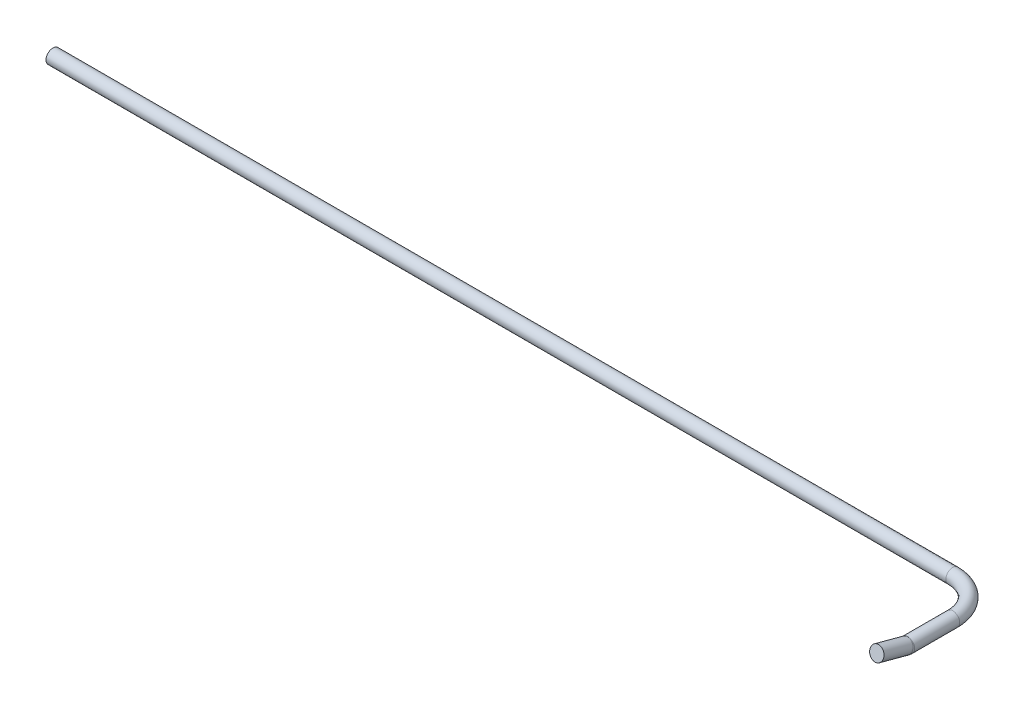
ISO-10303-21;
HEADER;
FILE_DESCRIPTION(('STEP AP214'),'2;1');
FILE_NAME('part.step','',(''),(''),'','','');
FILE_SCHEMA(('AUTOMOTIVE_DESIGN { 1 0 10303 214 1 1 1 1 }'));
ENDSEC;
DATA;
#1=APPLICATION_CONTEXT('core data for automotive mechanical design processes');
#2=APPLICATION_PROTOCOL_DEFINITION('international standard','automotive_design',2000,#1);
#3=PRODUCT_CONTEXT('',#1,'mechanical');
#4=PRODUCT('Part','Part','',(#3));
#5=PRODUCT_RELATED_PRODUCT_CATEGORY('part','',(#4));
#6=PRODUCT_DEFINITION_FORMATION('','',#4);
#7=PRODUCT_DEFINITION_CONTEXT('part definition',#1,'design');
#8=PRODUCT_DEFINITION('design','',#6,#7);
#9=PRODUCT_DEFINITION_SHAPE('','',#8);
#10=(LENGTH_UNIT() NAMED_UNIT(*) SI_UNIT(.MILLI.,.METRE.));
#11=(NAMED_UNIT(*) PLANE_ANGLE_UNIT() SI_UNIT($,.RADIAN.));
#12=(NAMED_UNIT(*) SI_UNIT($,.STERADIAN.) SOLID_ANGLE_UNIT());
#13=UNCERTAINTY_MEASURE_WITH_UNIT(LENGTH_MEASURE(1.E-05),#10,'distance_accuracy_value','');
#14=(GEOMETRIC_REPRESENTATION_CONTEXT(3) GLOBAL_UNCERTAINTY_ASSIGNED_CONTEXT((#13)) GLOBAL_UNIT_ASSIGNED_CONTEXT((#10,
#11,#12)) REPRESENTATION_CONTEXT('',''));
#15=CARTESIAN_POINT('',(0.,0.,0.));
#16=DIRECTION('',(0.,0.,1.));
#17=DIRECTION('',(1.,0.,0.));
#18=AXIS2_PLACEMENT_3D('',#15,#16,#17);
#19=CARTESIAN_POINT('',(0.,0.,-7.62));
#20=DIRECTION('',(0.,0.,1.));
#21=DIRECTION('',(1.,0.,0.));
#22=AXIS2_PLACEMENT_3D('',#19,#20,#21);
#23=CYLINDRICAL_SURFACE('',#22,1.1811);
#24=CARTESIAN_POINT('',(0.,0.,-7.62));
#25=DIRECTION('',(0.,0.,-1.));
#26=DIRECTION('',(-1.,0.,0.));
#27=AXIS2_PLACEMENT_3D('',#24,#25,#26);
#28=CIRCLE('',#27,1.1811);
#29=CARTESIAN_POINT('',(1.1811,0.,-7.62));
#30=VERTEX_POINT('',#29);
#31=EDGE_CURVE('E41',#30,#30,#28,.T.);
#32=ORIENTED_EDGE('',*,*,#31,.F.);
#33=EDGE_LOOP('',(#32));
#34=FACE_BOUND('',#33,.T.);
#35=CARTESIAN_POINT('',(0.,0.,0.));
#36=DIRECTION('',(0.,0.,1.));
#37=DIRECTION('',(1.,0.,0.));
#38=AXIS2_PLACEMENT_3D('',#35,#36,#37);
#39=CIRCLE('',#38,1.1811);
#40=CARTESIAN_POINT('',(0.,-1.1811,0.));
#41=VERTEX_POINT('',#40);
#42=EDGE_CURVE('E10',#41,#41,#39,.T.);
#43=ORIENTED_EDGE('',*,*,#42,.F.);
#44=EDGE_LOOP('',(#43));
#45=FACE_BOUND('',#44,.T.);
#46=ADVANCED_FACE('F31',(#34,#45),#23,.T.);
#47=CARTESIAN_POINT('',(-6.35,0.,-7.62));
#48=DIRECTION('',(0.,-1.,0.));
#49=DIRECTION('',(0.,0.,-1.));
#50=AXIS2_PLACEMENT_3D('',#47,#48,#49);
#51=TOROIDAL_SURFACE('',#50,6.35,1.1811);
#52=CARTESIAN_POINT('',(-6.35000000000002,0.,-13.97));
#53=DIRECTION('',(-1.,0.,0.));
#54=DIRECTION('',(0.,0.,1.));
#55=AXIS2_PLACEMENT_3D('',#52,#53,#54);
#56=CIRCLE('',#55,1.1811);
#57=CARTESIAN_POINT('',(-6.35000000000003,0.,-15.1511));
#58=VERTEX_POINT('',#57);
#59=EDGE_CURVE('E37',#58,#58,#56,.T.);
#60=CARTESIAN_POINT('',(-6.35,0.,-7.62));
#61=DIRECTION('',(0.,-1.,0.));
#62=DIRECTION('',(0.,0.,-1.));
#63=AXIS2_PLACEMENT_3D('',#60,#61,#62);
#64=CIRCLE('',#63,7.5311);
#65=EDGE_CURVE('',#58,#30,#64,.T.);
#66=ORIENTED_EDGE('',*,*,#59,.F.);
#67=ORIENTED_EDGE('',*,*,#31,.T.);
#68=ORIENTED_EDGE('',*,*,#65,.T.);
#69=ORIENTED_EDGE('',*,*,#65,.F.);
#70=EDGE_LOOP('',(#66,#68,#67,#69));
#71=FACE_BOUND('',#70,.T.);
#72=ADVANCED_FACE('F76',(#71),#51,.T.);
#73=CARTESIAN_POINT('',(-158.75,0.,-13.9699999999995));
#74=DIRECTION('',(1.,0.,0.));
#75=DIRECTION('',(0.,0.,-1.));
#76=AXIS2_PLACEMENT_3D('',#73,#74,#75);
#77=CYLINDRICAL_SURFACE('',#76,1.1811);
#78=CARTESIAN_POINT('',(-158.75,0.,-13.9699999999995));
#79=DIRECTION('',(-1.,0.,0.));
#80=DIRECTION('',(0.,0.,1.));
#81=AXIS2_PLACEMENT_3D('',#78,#79,#80);
#82=CIRCLE('',#81,1.1811);
#83=CARTESIAN_POINT('',(-158.75,0.,-15.1510999999995));
#84=VERTEX_POINT('',#83);
#85=EDGE_CURVE('E45',#84,#84,#82,.T.);
#86=CARTESIAN_POINT('',(-158.75,0.,-15.1510999999995));
#87=CARTESIAN_POINT('',(-157.1625,0.,-15.1510999999995));
#88=CARTESIAN_POINT('',(-155.575,0.,-15.1510999999995));
#89=CARTESIAN_POINT('',(-152.4,0.,-15.1510999999995));
#90=CARTESIAN_POINT('',(-150.8125,0.,-15.1510999999995));
#91=CARTESIAN_POINT('',(-147.6375,0.,-15.1510999999995));
#92=CARTESIAN_POINT('',(-146.05,0.,-15.1510999999995));
#93=CARTESIAN_POINT('',(-142.875,0.,-15.1510999999995));
#94=CARTESIAN_POINT('',(-141.2875,0.,-15.1510999999995));
#95=CARTESIAN_POINT('',(-138.1125,0.,-15.1510999999995));
#96=CARTESIAN_POINT('',(-136.525,0.,-15.1510999999995));
#97=CARTESIAN_POINT('',(-133.35,0.,-15.1510999999996));
#98=CARTESIAN_POINT('',(-131.7625,0.,-15.1510999999996));
#99=CARTESIAN_POINT('',(-128.5875,0.,-15.1510999999996));
#100=CARTESIAN_POINT('',(-127.,0.,-15.1510999999996));
#101=CARTESIAN_POINT('',(-123.825,0.,-15.1510999999996));
#102=CARTESIAN_POINT('',(-122.2375,0.,-15.1510999999996));
#103=CARTESIAN_POINT('',(-119.0625,0.,-15.1510999999996));
#104=CARTESIAN_POINT('',(-117.475,0.,-15.1510999999996));
#105=CARTESIAN_POINT('',(-114.3,0.,-15.1510999999996));
#106=CARTESIAN_POINT('',(-112.7125,0.,-15.1510999999996));
#107=CARTESIAN_POINT('',(-109.5375,0.,-15.1510999999996));
#108=CARTESIAN_POINT('',(-107.95,0.,-15.1510999999996));
#109=CARTESIAN_POINT('',(-104.775,0.,-15.1510999999997));
#110=CARTESIAN_POINT('',(-103.1875,0.,-15.1510999999997));
#111=CARTESIAN_POINT('',(-100.0125,0.,-15.1510999999997));
#112=CARTESIAN_POINT('',(-98.425,0.,-15.1510999999997));
#113=CARTESIAN_POINT('',(-95.25,0.,-15.1510999999997));
#114=CARTESIAN_POINT('',(-93.6625,0.,-15.1510999999997));
#115=CARTESIAN_POINT('',(-90.4875,0.,-15.1510999999997));
#116=CARTESIAN_POINT('',(-88.9,0.,-15.1510999999997));
#117=CARTESIAN_POINT('',(-85.725,0.,-15.1510999999997));
#118=CARTESIAN_POINT('',(-84.1375,0.,-15.1510999999997));
#119=CARTESIAN_POINT('',(-80.9625,0.,-15.1510999999997));
#120=CARTESIAN_POINT('',(-79.375,0.,-15.1510999999997));
#121=CARTESIAN_POINT('',(-76.2,0.,-15.1510999999998));
#122=CARTESIAN_POINT('',(-74.6125,0.,-15.1510999999998));
#123=CARTESIAN_POINT('',(-71.4375,0.,-15.1510999999998));
#124=CARTESIAN_POINT('',(-69.85,0.,-15.1510999999998));
#125=CARTESIAN_POINT('',(-66.675,0.,-15.1510999999998));
#126=CARTESIAN_POINT('',(-65.0875,0.,-15.1510999999998));
#127=CARTESIAN_POINT('',(-61.9125,0.,-15.1510999999998));
#128=CARTESIAN_POINT('',(-60.325,0.,-15.1510999999998));
#129=CARTESIAN_POINT('',(-57.15,0.,-15.1510999999998));
#130=CARTESIAN_POINT('',(-55.5625,0.,-15.1510999999998));
#131=CARTESIAN_POINT('',(-52.3875,0.,-15.1510999999998));
#132=CARTESIAN_POINT('',(-50.8,0.,-15.1510999999998));
#133=CARTESIAN_POINT('',(-47.625,0.,-15.1510999999999));
#134=CARTESIAN_POINT('',(-46.0375,0.,-15.1510999999999));
#135=CARTESIAN_POINT('',(-42.8625,0.,-15.1510999999999));
#136=CARTESIAN_POINT('',(-41.275,0.,-15.1510999999999));
#137=CARTESIAN_POINT('',(-38.1,0.,-15.1510999999999));
#138=CARTESIAN_POINT('',(-36.5125,0.,-15.1510999999999));
#139=CARTESIAN_POINT('',(-33.3375,0.,-15.1510999999999));
#140=CARTESIAN_POINT('',(-31.75,0.,-15.1510999999999));
#141=CARTESIAN_POINT('',(-28.575,0.,-15.1510999999999));
#142=CARTESIAN_POINT('',(-26.9875,0.,-15.1510999999999));
#143=CARTESIAN_POINT('',(-23.8125,0.,-15.1510999999999));
#144=CARTESIAN_POINT('',(-22.225,0.,-15.1510999999999));
#145=CARTESIAN_POINT('',(-19.05,0.,-15.1511));
#146=CARTESIAN_POINT('',(-17.4625,0.,-15.1511));
#147=CARTESIAN_POINT('',(-14.2875,0.,-15.1511));
#148=CARTESIAN_POINT('',(-12.7,0.,-15.1511));
#149=CARTESIAN_POINT('',(-9.52500000000003,0.,-15.1511));
#150=CARTESIAN_POINT('',(-7.93750000000002,0.,-15.1511));
#151=CARTESIAN_POINT('',(-6.35000000000002,0.,-15.1511));
#152=B_SPLINE_CURVE_WITH_KNOTS('',3,(#86,#87,#88,#89,#90,#91,#92,#93,#94,#95,#96,#97,#98,#99,
#100,#101,#102,#103,#104,#105,#106,#107,#108,#109,#110,#111,#112,#113,#114,#115,#116,#117,#118,
#119,#120,#121,#122,#123,#124,#125,#126,#127,#128,#129,#130,#131,#132,#133,#134,#135,#136,#137,
#138,#139,#140,#141,#142,#143,#144,#145,#146,#147,#148,#149,#150,#151),.UNSPECIFIED.,.F.,.F.,(4,
2,2,2,2,2,2,2,2,2,2,2,2,2,2,2,2,2,2,2,2,2,2,2,2,2,2,2,2,2,2,2,4),(0.,4.76249999999998,
9.52499999999998,14.2875,19.05,23.8125,28.575,33.3375,38.1,42.8625,47.625,52.3875,57.15,61.9125,
66.675,71.4375,76.2,80.9625,85.725,90.4875,95.25,100.0125,104.775,109.5375,114.3,119.0625,
123.825,128.5875,133.35,138.1125,142.875,147.6375,152.4),.UNSPECIFIED.);
#153=EDGE_CURVE('BSEAM72',#84,#58,#152,.T.);
#154=ORIENTED_EDGE('',*,*,#85,.F.);
#155=ORIENTED_EDGE('',*,*,#59,.T.);
#156=ORIENTED_EDGE('',*,*,#153,.T.);
#157=ORIENTED_EDGE('',*,*,#153,.F.);
#158=EDGE_LOOP('',(#154,#156,#155,#157));
#159=FACE_BOUND('',#158,.T.);
#160=ADVANCED_FACE('F72',(#159),#77,.T.);
#161=CARTESIAN_POINT('',(-158.75,0.,-13.9699999999995));
#162=DIRECTION('',(-1.,0.,0.));
#163=DIRECTION('',(0.,0.,1.));
#164=AXIS2_PLACEMENT_3D('',#161,#162,#163);
#165=PLANE('',#164);
#166=ORIENTED_EDGE('',*,*,#85,.T.);
#167=EDGE_LOOP('',(#166));
#168=FACE_BOUND('',#167,.T.);
#169=ADVANCED_FACE('F67',(#168),#165,.T.);
#170=CARTESIAN_POINT('',(0.,1.27,0.));
#171=DIRECTION('',(1.,0.,0.));
#172=DIRECTION('',(0.,0.,-1.));
#173=AXIS2_PLACEMENT_3D('',#170,#171,#172);
#174=TOROIDAL_SURFACE('',#173,1.27,1.1811);
#175=CARTESIAN_POINT('',(0.,0.0432742006128835,0.328700187280202));
#176=DIRECTION('',(0.,0.258819045102521,0.965925826289068));
#177=DIRECTION('',(1.,0.,0.));
#178=AXIS2_PLACEMENT_3D('',#175,#176,#177);
#179=CIRCLE('',#178,1.1811);
#180=CARTESIAN_POINT('',(0.,-1.09758079281714,0.63439136145079));
#181=VERTEX_POINT('',#180);
#182=EDGE_CURVE('E50',#181,#181,#179,.T.);
#183=CARTESIAN_POINT('',(0.,1.27,0.));
#184=DIRECTION('',(1.,0.,0.));
#185=DIRECTION('',(0.,0.,-1.));
#186=AXIS2_PLACEMENT_3D('',#183,#184,#185);
#187=CIRCLE('',#186,2.4511);
#188=EDGE_CURVE('',#181,#41,#187,.T.);
#189=ORIENTED_EDGE('',*,*,#182,.F.);
#190=ORIENTED_EDGE('',*,*,#42,.T.);
#191=ORIENTED_EDGE('',*,*,#188,.T.);
#192=ORIENTED_EDGE('',*,*,#188,.F.);
#193=EDGE_LOOP('',(#189,#191,#190,#192));
#194=FACE_BOUND('',#193,.T.);
#195=ADVANCED_FACE('F62',(#194),#174,.T.);
#196=CARTESIAN_POINT('',(0.,1.35807494973369,5.23560338482867));
#197=DIRECTION('',(0.,-0.258819045102521,-0.965925826289068));
#198=DIRECTION('',(0.,0.965925826289068,-0.258819045102521));
#199=AXIS2_PLACEMENT_3D('',#196,#197,#198);
#200=CYLINDRICAL_SURFACE('',#199,1.1811);
#201=CARTESIAN_POINT('',(0.,1.35807494973369,5.23560338482867));
#202=DIRECTION('',(0.,0.258819045102521,0.965925826289068));
#203=DIRECTION('',(0.,-0.965925826289068,0.258819045102521));
#204=AXIS2_PLACEMENT_3D('',#201,#202,#203);
#205=CIRCLE('',#204,1.1811);
#206=CARTESIAN_POINT('',(0.,0.217219956303674,5.54129455899926));
#207=VERTEX_POINT('',#206);
#208=EDGE_CURVE('E53',#207,#207,#205,.T.);
#209=ORIENTED_EDGE('',*,*,#208,.F.);
#210=EDGE_LOOP('',(#209));
#211=FACE_BOUND('',#210,.T.);
#212=ORIENTED_EDGE('',*,*,#182,.T.);
#213=EDGE_LOOP('',(#212));
#214=FACE_BOUND('',#213,.T.);
#215=ADVANCED_FACE('F59',(#211,#214),#200,.T.);
#216=CARTESIAN_POINT('',(0.,1.35807494973369,5.23560338482867));
#217=DIRECTION('',(0.,0.258819045102521,0.965925826289068));
#218=DIRECTION('',(0.,-0.965925826289068,0.258819045102521));
#219=AXIS2_PLACEMENT_3D('',#216,#217,#218);
#220=PLANE('',#219);
#221=ORIENTED_EDGE('',*,*,#208,.T.);
#222=EDGE_LOOP('',(#221));
#223=FACE_BOUND('',#222,.T.);
#224=ADVANCED_FACE('F57',(#223),#220,.T.);
#225=CLOSED_SHELL('',(#46,#72,#160,#169,#195,#215,#224));
#226=MANIFOLD_SOLID_BREP('B2',#225);
#227=ADVANCED_BREP_SHAPE_REPRESENTATION('',(#18,#226),#14);
#228=SHAPE_DEFINITION_REPRESENTATION(#9,#227);
ENDSEC;
END-ISO-10303-21;
